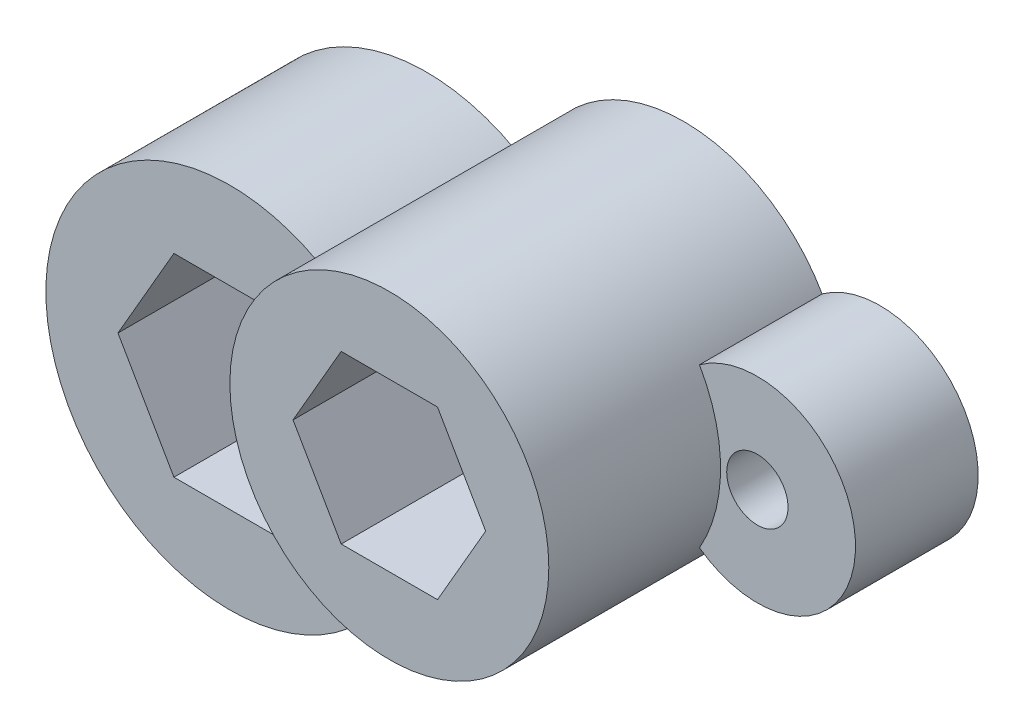
ISO-10303-21;
HEADER;
FILE_DESCRIPTION(('STEP AP214'),'2;1');
FILE_NAME('part.step','',(''),(''),'','','');
FILE_SCHEMA(('AUTOMOTIVE_DESIGN { 1 0 10303 214 1 1 1 1 }'));
ENDSEC;
DATA;
#1=APPLICATION_CONTEXT('core data for automotive mechanical design processes');
#2=APPLICATION_PROTOCOL_DEFINITION('international standard','automotive_design',2000,#1);
#3=PRODUCT_CONTEXT('',#1,'mechanical');
#4=PRODUCT('Part','Part','',(#3));
#5=PRODUCT_RELATED_PRODUCT_CATEGORY('part','',(#4));
#6=PRODUCT_DEFINITION_FORMATION('','',#4);
#7=PRODUCT_DEFINITION_CONTEXT('part definition',#1,'design');
#8=PRODUCT_DEFINITION('design','',#6,#7);
#9=PRODUCT_DEFINITION_SHAPE('','',#8);
#10=(LENGTH_UNIT() NAMED_UNIT(*) SI_UNIT(.MILLI.,.METRE.));
#11=(NAMED_UNIT(*) PLANE_ANGLE_UNIT() SI_UNIT($,.RADIAN.));
#12=(NAMED_UNIT(*) SI_UNIT($,.STERADIAN.) SOLID_ANGLE_UNIT());
#13=UNCERTAINTY_MEASURE_WITH_UNIT(LENGTH_MEASURE(1.E-05),#10,'distance_accuracy_value','');
#14=(GEOMETRIC_REPRESENTATION_CONTEXT(3) GLOBAL_UNCERTAINTY_ASSIGNED_CONTEXT((#13)) GLOBAL_UNIT_ASSIGNED_CONTEXT((#10,
#11,#12)) REPRESENTATION_CONTEXT('',''));
#15=CARTESIAN_POINT('',(0.,0.,0.));
#16=DIRECTION('',(0.,0.,1.));
#17=DIRECTION('',(1.,0.,0.));
#18=AXIS2_PLACEMENT_3D('',#15,#16,#17);
#19=CARTESIAN_POINT('',(0.,0.,8.));
#20=DIRECTION('',(0.,0.,1.));
#21=DIRECTION('',(1.,0.,0.));
#22=AXIS2_PLACEMENT_3D('',#19,#20,#21);
#23=PLANE('',#22);
#24=CARTESIAN_POINT('',(10.5000000000009,4.5,8.));
#25=DIRECTION('',(0.,0.,1.));
#26=DIRECTION('',(1.,0.,0.));
#27=AXIS2_PLACEMENT_3D('',#24,#25,#26);
#28=CIRCLE('',#27,6.50000000000048);
#29=CARTESIAN_POINT('',(4.22530233261804,6.19651677944735,8.));
#30=VERTEX_POINT('',#29);
#31=CARTESIAN_POINT('',(7.40113444899148,-1.21375815875798,8.));
#32=VERTEX_POINT('',#31);
#33=EDGE_CURVE('E165',#30,#32,#28,.T.);
#34=ORIENTED_EDGE('',*,*,#33,.F.);
#35=CARTESIAN_POINT('',(0.,0.,8.));
#36=DIRECTION('',(0.,0.,1.));
#37=DIRECTION('',(1.,0.,0.));
#38=AXIS2_PLACEMENT_3D('',#35,#36,#37);
#39=CIRCLE('',#38,7.5);
#40=EDGE_CURVE('E217',#30,#32,#39,.T.);
#41=ORIENTED_EDGE('',*,*,#40,.T.);
#42=EDGE_LOOP('',(#34,#41));
#43=FACE_BOUND('',#42,.T.);
#44=DIRECTION('',(0.5,0.866025403784439,0.));
#45=VECTOR('',#44,1.);
#46=CARTESIAN_POINT('',(2.28053356329902,-3.95,8.));
#47=LINE('',#46,#45);
#48=CARTESIAN_POINT('',(2.28053356329902,-3.95,8.));
#49=VERTEX_POINT('',#48);
#50=CARTESIAN_POINT('',(4.56106712659804,0.,8.));
#51=VERTEX_POINT('',#50);
#52=EDGE_CURVE('E175',#49,#51,#47,.T.);
#53=ORIENTED_EDGE('',*,*,#52,.F.);
#54=DIRECTION('',(1.,0.,0.));
#55=VECTOR('',#54,1.);
#56=CARTESIAN_POINT('',(-2.28053356329902,-3.95,8.));
#57=LINE('',#56,#55);
#58=CARTESIAN_POINT('',(-2.28053356329902,-3.95,8.));
#59=VERTEX_POINT('',#58);
#60=EDGE_CURVE('E173',#59,#49,#57,.T.);
#61=ORIENTED_EDGE('',*,*,#60,.F.);
#62=DIRECTION('',(0.5,-0.866025403784439,0.));
#63=VECTOR('',#62,1.);
#64=CARTESIAN_POINT('',(-4.56106712659804,0.,8.));
#65=LINE('',#64,#63);
#66=CARTESIAN_POINT('',(-4.56106712659804,0.,8.));
#67=VERTEX_POINT('',#66);
#68=EDGE_CURVE('E185',#67,#59,#65,.T.);
#69=ORIENTED_EDGE('',*,*,#68,.F.);
#70=DIRECTION('',(-0.5,-0.866025403784439,0.));
#71=VECTOR('',#70,1.);
#72=CARTESIAN_POINT('',(-2.28053356329902,3.95,8.));
#73=LINE('',#72,#71);
#74=CARTESIAN_POINT('',(-2.28053356329902,3.95,8.));
#75=VERTEX_POINT('',#74);
#76=EDGE_CURVE('E182',#75,#67,#73,.T.);
#77=ORIENTED_EDGE('',*,*,#76,.F.);
#78=DIRECTION('',(-1.,0.,0.));
#79=VECTOR('',#78,1.);
#80=CARTESIAN_POINT('',(2.28053356329902,3.95,8.));
#81=LINE('',#80,#79);
#82=CARTESIAN_POINT('',(2.28053356329902,3.95,8.));
#83=VERTEX_POINT('',#82);
#84=EDGE_CURVE('E180',#83,#75,#81,.T.);
#85=ORIENTED_EDGE('',*,*,#84,.F.);
#86=DIRECTION('',(-0.5,0.866025403784439,0.));
#87=VECTOR('',#86,1.);
#88=CARTESIAN_POINT('',(4.56106712659804,0.,8.));
#89=LINE('',#88,#87);
#90=EDGE_CURVE('E178',#51,#83,#89,.T.);
#91=ORIENTED_EDGE('',*,*,#90,.F.);
#92=EDGE_LOOP('',(#53,#61,#69,#77,#85,#91));
#93=FACE_BOUND('',#92,.T.);
#94=ADVANCED_FACE('F33',(#43,#93),#23,.T.);
#95=CARTESIAN_POINT('',(0.,0.,0.));
#96=DIRECTION('',(0.,0.,1.));
#97=DIRECTION('',(1.,0.,0.));
#98=AXIS2_PLACEMENT_3D('',#95,#96,#97);
#99=PLANE('',#98);
#100=CARTESIAN_POINT('',(10.5000000000009,4.5,0.));
#101=DIRECTION('',(0.,0.,-1.));
#102=DIRECTION('',(-1.,0.,0.));
#103=AXIS2_PLACEMENT_3D('',#100,#101,#102);
#104=CIRCLE('',#103,6.50000000000048);
#105=CARTESIAN_POINT('',(4.22530233261804,6.19651677944735,0.));
#106=VERTEX_POINT('',#105);
#107=CARTESIAN_POINT('',(16.1406250000013,7.73006959822488,0.));
#108=VERTEX_POINT('',#107);
#109=EDGE_CURVE('E156',#106,#108,#104,.T.);
#110=ORIENTED_EDGE('',*,*,#109,.T.);
#111=CARTESIAN_POINT('',(18.5000000000009,4.49999999999996,0.));
#112=DIRECTION('',(0.,0.,-1.));
#113=DIRECTION('',(-1.,0.,0.));
#114=AXIS2_PLACEMENT_3D('',#111,#112,#113);
#115=CIRCLE('',#114,4.);
#116=CARTESIAN_POINT('',(16.1406250000013,1.26993040177507,0.));
#117=VERTEX_POINT('',#116);
#118=EDGE_CURVE('E48',#108,#117,#115,.T.);
#119=ORIENTED_EDGE('',*,*,#118,.T.);
#120=CARTESIAN_POINT('',(7.40113444899148,-1.21375815875798,0.));
#121=VERTEX_POINT('',#120);
#122=EDGE_CURVE('E52',#117,#121,#104,.T.);
#123=ORIENTED_EDGE('',*,*,#122,.T.);
#124=CARTESIAN_POINT('',(0.,0.,0.));
#125=DIRECTION('',(0.,0.,1.));
#126=DIRECTION('',(1.,0.,0.));
#127=AXIS2_PLACEMENT_3D('',#124,#125,#126);
#128=CIRCLE('',#127,7.5);
#129=EDGE_CURVE('E160',#106,#121,#128,.T.);
#130=ORIENTED_EDGE('',*,*,#129,.F.);
#131=EDGE_LOOP('',(#110,#119,#123,#130));
#132=FACE_BOUND('',#131,.T.);
#133=DIRECTION('',(1.,0.,0.));
#134=VECTOR('',#133,1.);
#135=CARTESIAN_POINT('',(-2.28053356329902,-3.95,0.));
#136=LINE('',#135,#134);
#137=CARTESIAN_POINT('',(-2.28053356329902,-3.95,0.));
#138=VERTEX_POINT('',#137);
#139=CARTESIAN_POINT('',(2.28053356329902,-3.95,0.));
#140=VERTEX_POINT('',#139);
#141=EDGE_CURVE('E172',#138,#140,#136,.T.);
#142=ORIENTED_EDGE('',*,*,#141,.T.);
#143=DIRECTION('',(0.5,0.866025403784439,0.));
#144=VECTOR('',#143,1.);
#145=CARTESIAN_POINT('',(2.28053356329902,-3.95,0.));
#146=LINE('',#145,#144);
#147=CARTESIAN_POINT('',(4.56106712659804,0.,0.));
#148=VERTEX_POINT('',#147);
#149=EDGE_CURVE('E190',#140,#148,#146,.T.);
#150=ORIENTED_EDGE('',*,*,#149,.T.);
#151=DIRECTION('',(-0.5,0.866025403784439,0.));
#152=VECTOR('',#151,1.);
#153=CARTESIAN_POINT('',(4.56106712659804,0.,0.));
#154=LINE('',#153,#152);
#155=CARTESIAN_POINT('',(2.28053356329902,3.95,0.));
#156=VERTEX_POINT('',#155);
#157=EDGE_CURVE('E193',#148,#156,#154,.T.);
#158=ORIENTED_EDGE('',*,*,#157,.T.);
#159=DIRECTION('',(-1.,0.,0.));
#160=VECTOR('',#159,1.);
#161=CARTESIAN_POINT('',(2.28053356329902,3.95,0.));
#162=LINE('',#161,#160);
#163=CARTESIAN_POINT('',(-2.28053356329902,3.95,0.));
#164=VERTEX_POINT('',#163);
#165=EDGE_CURVE('E196',#156,#164,#162,.T.);
#166=ORIENTED_EDGE('',*,*,#165,.T.);
#167=DIRECTION('',(-0.5,-0.866025403784439,0.));
#168=VECTOR('',#167,1.);
#169=CARTESIAN_POINT('',(-2.28053356329902,3.95,0.));
#170=LINE('',#169,#168);
#171=CARTESIAN_POINT('',(-4.56106712659804,0.,0.));
#172=VERTEX_POINT('',#171);
#173=EDGE_CURVE('E199',#164,#172,#170,.T.);
#174=ORIENTED_EDGE('',*,*,#173,.T.);
#175=DIRECTION('',(0.5,-0.866025403784439,0.));
#176=VECTOR('',#175,1.);
#177=CARTESIAN_POINT('',(-4.56106712659804,0.,0.));
#178=LINE('',#177,#176);
#179=EDGE_CURVE('E176',#172,#138,#178,.T.);
#180=ORIENTED_EDGE('',*,*,#179,.T.);
#181=EDGE_LOOP('',(#142,#150,#158,#166,#174,#180));
#182=FACE_BOUND('',#181,.T.);
#183=DIRECTION('',(-1.,0.,0.));
#184=VECTOR('',#183,1.);
#185=CARTESIAN_POINT('',(12.4629909152456,1.1,0.));
#186=LINE('',#185,#184);
#187=CARTESIAN_POINT('',(12.4629909152456,1.1,0.));
#188=VERTEX_POINT('',#187);
#189=CARTESIAN_POINT('',(8.53700908475617,1.1,0.));
#190=VERTEX_POINT('',#189);
#191=EDGE_CURVE('E450',#188,#190,#186,.T.);
#192=ORIENTED_EDGE('',*,*,#191,.F.);
#193=DIRECTION('',(-0.5,-0.866025403784439,0.));
#194=VECTOR('',#193,1.);
#195=CARTESIAN_POINT('',(14.4259818304903,4.5,0.));
#196=LINE('',#195,#194);
#197=CARTESIAN_POINT('',(14.4259818304903,4.5,0.));
#198=VERTEX_POINT('',#197);
#199=EDGE_CURVE('E456',#198,#188,#196,.T.);
#200=ORIENTED_EDGE('',*,*,#199,.F.);
#201=DIRECTION('',(0.500000000000056,-0.866025403784406,0.));
#202=VECTOR('',#201,1.);
#203=CARTESIAN_POINT('',(12.4629909152453,7.89999999999999,0.));
#204=LINE('',#203,#202);
#205=CARTESIAN_POINT('',(12.4629909152453,7.89999999999999,0.));
#206=VERTEX_POINT('',#205);
#207=EDGE_CURVE('E482',#206,#198,#204,.T.);
#208=ORIENTED_EDGE('',*,*,#207,.F.);
#209=DIRECTION('',(1.,0.,0.));
#210=VECTOR('',#209,1.);
#211=CARTESIAN_POINT('',(8.53700908475616,7.89999999999999,0.));
#212=LINE('',#211,#210);
#213=CARTESIAN_POINT('',(8.53700908475616,7.89999999999999,0.));
#214=VERTEX_POINT('',#213);
#215=EDGE_CURVE('E479',#214,#206,#212,.T.);
#216=ORIENTED_EDGE('',*,*,#215,.F.);
#217=DIRECTION('',(0.5,0.866025403784438,0.));
#218=VECTOR('',#217,1.);
#219=CARTESIAN_POINT('',(6.57401816951144,4.5,0.));
#220=LINE('',#219,#218);
#221=CARTESIAN_POINT('',(6.57401816951144,4.5,0.));
#222=VERTEX_POINT('',#221);
#223=EDGE_CURVE('E476',#222,#214,#220,.T.);
#224=ORIENTED_EDGE('',*,*,#223,.F.);
#225=DIRECTION('',(-0.5,0.866025403784439,0.));
#226=VECTOR('',#225,1.);
#227=CARTESIAN_POINT('',(8.53700908475617,1.1,0.));
#228=LINE('',#227,#226);
#229=EDGE_CURVE('E473',#190,#222,#228,.T.);
#230=ORIENTED_EDGE('',*,*,#229,.F.);
#231=EDGE_LOOP('',(#192,#200,#208,#216,#224,#230));
#232=FACE_BOUND('',#231,.T.);
#233=CARTESIAN_POINT('',(18.5000000000009,4.49999999999996,0.));
#234=DIRECTION('',(0.,0.,-1.));
#235=DIRECTION('',(-1.,0.,0.));
#236=AXIS2_PLACEMENT_3D('',#233,#234,#235);
#237=CIRCLE('',#236,1.25000000000104);
#238=CARTESIAN_POINT('',(17.2499999999999,4.49999999999996,0.));
#239=VERTEX_POINT('',#238);
#240=EDGE_CURVE('E445',#239,#239,#237,.T.);
#241=ORIENTED_EDGE('',*,*,#240,.F.);
#242=EDGE_LOOP('',(#241));
#243=FACE_BOUND('',#242,.T.);
#244=ADVANCED_FACE('F158',(#132,#182,#232,#243),#99,.F.);
#245=CARTESIAN_POINT('',(0.,0.,8.));
#246=DIRECTION('',(0.,0.,-1.));
#247=DIRECTION('',(-1.,0.,0.));
#248=AXIS2_PLACEMENT_3D('',#245,#246,#247);
#249=CYLINDRICAL_SURFACE('',#248,7.5);
#250=ORIENTED_EDGE('',*,*,#129,.T.);
#251=DIRECTION('',(0.,0.,-1.));
#252=VECTOR('',#251,1.);
#253=CARTESIAN_POINT('',(7.40113444899148,-1.21375815875798,6.));
#254=LINE('',#253,#252);
#255=EDGE_CURVE('E223',#121,#32,#254,.F.);
#256=ORIENTED_EDGE('',*,*,#255,.T.);
#257=ORIENTED_EDGE('',*,*,#40,.F.);
#258=DIRECTION('',(0.,0.,-1.));
#259=VECTOR('',#258,1.);
#260=CARTESIAN_POINT('',(4.22530233261804,6.19651677944735,6.));
#261=LINE('',#260,#259);
#262=EDGE_CURVE('E220',#30,#106,#261,.T.);
#263=ORIENTED_EDGE('',*,*,#262,.T.);
#264=EDGE_LOOP('',(#250,#256,#257,#263));
#265=FACE_BOUND('',#264,.T.);
#266=ADVANCED_FACE('F35',(#265),#249,.T.);
#267=CARTESIAN_POINT('',(-2.28053356329902,-3.95,8.));
#268=DIRECTION('',(0.,1.,0.));
#269=DIRECTION('',(-1.,0.,0.));
#270=AXIS2_PLACEMENT_3D('',#267,#268,#269);
#271=PLANE('',#270);
#272=ORIENTED_EDGE('',*,*,#141,.F.);
#273=DIRECTION('',(0.,0.,-1.));
#274=VECTOR('',#273,1.);
#275=CARTESIAN_POINT('',(-2.28053356329902,-3.95,8.));
#276=LINE('',#275,#274);
#277=EDGE_CURVE('E187',#59,#138,#276,.T.);
#278=ORIENTED_EDGE('',*,*,#277,.F.);
#279=ORIENTED_EDGE('',*,*,#60,.T.);
#280=DIRECTION('',(0.,0.,-1.));
#281=VECTOR('',#280,1.);
#282=CARTESIAN_POINT('',(2.28053356329902,-3.95,8.));
#283=LINE('',#282,#281);
#284=EDGE_CURVE('E214',#49,#140,#283,.T.);
#285=ORIENTED_EDGE('',*,*,#284,.T.);
#286=EDGE_LOOP('',(#272,#278,#279,#285));
#287=FACE_BOUND('',#286,.T.);
#288=ADVANCED_FACE('F248',(#287),#271,.T.);
#289=CARTESIAN_POINT('',(2.28053356329902,-3.95,8.));
#290=DIRECTION('',(-0.866025403784439,0.5,0.));
#291=DIRECTION('',(-0.5,-0.866025403784439,0.));
#292=AXIS2_PLACEMENT_3D('',#289,#290,#291);
#293=PLANE('',#292);
#294=ORIENTED_EDGE('',*,*,#149,.F.);
#295=ORIENTED_EDGE('',*,*,#284,.F.);
#296=ORIENTED_EDGE('',*,*,#52,.T.);
#297=DIRECTION('',(0.,0.,-1.));
#298=VECTOR('',#297,1.);
#299=CARTESIAN_POINT('',(4.56106712659804,0.,8.));
#300=LINE('',#299,#298);
#301=EDGE_CURVE('E212',#51,#148,#300,.T.);
#302=ORIENTED_EDGE('',*,*,#301,.T.);
#303=EDGE_LOOP('',(#294,#295,#296,#302));
#304=FACE_BOUND('',#303,.T.);
#305=ADVANCED_FACE('F240',(#304),#293,.T.);
#306=CARTESIAN_POINT('',(4.56106712659804,0.,8.));
#307=DIRECTION('',(-0.866025403784439,-0.5,0.));
#308=DIRECTION('',(0.5,-0.866025403784439,0.));
#309=AXIS2_PLACEMENT_3D('',#306,#307,#308);
#310=PLANE('',#309);
#311=ORIENTED_EDGE('',*,*,#157,.F.);
#312=ORIENTED_EDGE('',*,*,#301,.F.);
#313=ORIENTED_EDGE('',*,*,#90,.T.);
#314=DIRECTION('',(0.,0.,-1.));
#315=VECTOR('',#314,1.);
#316=CARTESIAN_POINT('',(2.28053356329902,3.95,8.));
#317=LINE('',#316,#315);
#318=EDGE_CURVE('E210',#83,#156,#317,.T.);
#319=ORIENTED_EDGE('',*,*,#318,.T.);
#320=EDGE_LOOP('',(#311,#312,#313,#319));
#321=FACE_BOUND('',#320,.T.);
#322=ADVANCED_FACE('F243',(#321),#310,.T.);
#323=CARTESIAN_POINT('',(2.28053356329902,3.95,8.));
#324=DIRECTION('',(0.,-1.,0.));
#325=DIRECTION('',(1.,0.,0.));
#326=AXIS2_PLACEMENT_3D('',#323,#324,#325);
#327=PLANE('',#326);
#328=ORIENTED_EDGE('',*,*,#165,.F.);
#329=ORIENTED_EDGE('',*,*,#318,.F.);
#330=ORIENTED_EDGE('',*,*,#84,.T.);
#331=DIRECTION('',(0.,0.,-1.));
#332=VECTOR('',#331,1.);
#333=CARTESIAN_POINT('',(-2.28053356329902,3.95,8.));
#334=LINE('',#333,#332);
#335=EDGE_CURVE('E208',#75,#164,#334,.T.);
#336=ORIENTED_EDGE('',*,*,#335,.T.);
#337=EDGE_LOOP('',(#328,#329,#330,#336));
#338=FACE_BOUND('',#337,.T.);
#339=ADVANCED_FACE('F259',(#338),#327,.T.);
#340=CARTESIAN_POINT('',(-2.28053356329902,3.95,8.));
#341=DIRECTION('',(0.866025403784439,-0.5,0.));
#342=DIRECTION('',(0.5,0.866025403784439,0.));
#343=AXIS2_PLACEMENT_3D('',#340,#341,#342);
#344=PLANE('',#343);
#345=ORIENTED_EDGE('',*,*,#173,.F.);
#346=ORIENTED_EDGE('',*,*,#335,.F.);
#347=ORIENTED_EDGE('',*,*,#76,.T.);
#348=DIRECTION('',(0.,0.,-1.));
#349=VECTOR('',#348,1.);
#350=CARTESIAN_POINT('',(-4.56106712659804,0.,8.));
#351=LINE('',#350,#349);
#352=EDGE_CURVE('E206',#67,#172,#351,.T.);
#353=ORIENTED_EDGE('',*,*,#352,.T.);
#354=EDGE_LOOP('',(#345,#346,#347,#353));
#355=FACE_BOUND('',#354,.T.);
#356=ADVANCED_FACE('F256',(#355),#344,.T.);
#357=CARTESIAN_POINT('',(-4.56106712659804,0.,8.));
#358=DIRECTION('',(0.866025403784439,0.5,0.));
#359=DIRECTION('',(-0.5,0.866025403784439,0.));
#360=AXIS2_PLACEMENT_3D('',#357,#358,#359);
#361=PLANE('',#360);
#362=ORIENTED_EDGE('',*,*,#179,.F.);
#363=ORIENTED_EDGE('',*,*,#352,.F.);
#364=ORIENTED_EDGE('',*,*,#68,.T.);
#365=ORIENTED_EDGE('',*,*,#277,.T.);
#366=EDGE_LOOP('',(#362,#363,#364,#365));
#367=FACE_BOUND('',#366,.T.);
#368=ADVANCED_FACE('F252',(#367),#361,.T.);
#369=CARTESIAN_POINT('',(10.5000000000009,4.5,12.));
#370=DIRECTION('',(0.,0.,-1.));
#371=DIRECTION('',(-1.,0.,0.));
#372=AXIS2_PLACEMENT_3D('',#369,#370,#371);
#373=CYLINDRICAL_SURFACE('',#372,6.50000000000048);
#374=DIRECTION('',(0.,0.,-1.));
#375=VECTOR('',#374,1.);
#376=CARTESIAN_POINT('',(16.1406250000013,1.26993040177507,2.5));
#377=LINE('',#376,#375);
#378=CARTESIAN_POINT('',(16.1406250000013,1.26993040177506,5.));
#379=VERTEX_POINT('',#378);
#380=EDGE_CURVE('E11',#379,#117,#377,.T.);
#381=ORIENTED_EDGE('',*,*,#380,.F.);
#382=CARTESIAN_POINT('',(10.5000000000009,4.5,5.));
#383=DIRECTION('',(0.,0.,-1.));
#384=DIRECTION('',(-1.,0.,0.));
#385=AXIS2_PLACEMENT_3D('',#382,#383,#384);
#386=CIRCLE('',#385,6.50000000000048);
#387=CARTESIAN_POINT('',(16.1406250000013,7.73006959822488,5.));
#388=VERTEX_POINT('',#387);
#389=EDGE_CURVE('E157',#379,#388,#386,.F.);
#390=ORIENTED_EDGE('',*,*,#389,.T.);
#391=DIRECTION('',(0.,0.,-1.));
#392=VECTOR('',#391,1.);
#393=CARTESIAN_POINT('',(16.1406250000013,7.73006959822488,2.5));
#394=LINE('',#393,#392);
#395=EDGE_CURVE('E41',#108,#388,#394,.F.);
#396=ORIENTED_EDGE('',*,*,#395,.F.);
#397=ORIENTED_EDGE('',*,*,#109,.F.);
#398=ORIENTED_EDGE('',*,*,#262,.F.);
#399=ORIENTED_EDGE('',*,*,#33,.T.);
#400=ORIENTED_EDGE('',*,*,#255,.F.);
#401=ORIENTED_EDGE('',*,*,#122,.F.);
#402=EDGE_LOOP('',(#381,#390,#396,#397,#398,#399,#400,#401));
#403=FACE_BOUND('',#402,.T.);
#404=CARTESIAN_POINT('',(10.5000000000009,4.5,12.));
#405=DIRECTION('',(0.,0.,-1.));
#406=DIRECTION('',(-1.,0.,0.));
#407=AXIS2_PLACEMENT_3D('',#404,#405,#406);
#408=CIRCLE('',#407,6.50000000000048);
#409=CARTESIAN_POINT('',(4.00000000000041,4.5,12.));
#410=VERTEX_POINT('',#409);
#411=EDGE_CURVE('E162',#410,#410,#408,.T.);
#412=ORIENTED_EDGE('',*,*,#411,.T.);
#413=EDGE_LOOP('',(#412));
#414=FACE_BOUND('',#413,.T.);
#415=ADVANCED_FACE('F153',(#403,#414),#373,.T.);
#416=CARTESIAN_POINT('',(10.5000000000009,4.5,12.));
#417=DIRECTION('',(0.,0.,-1.));
#418=DIRECTION('',(-1.,0.,0.));
#419=AXIS2_PLACEMENT_3D('',#416,#417,#418);
#420=PLANE('',#419);
#421=DIRECTION('',(-0.5,-0.866025403784439,0.));
#422=VECTOR('',#421,1.);
#423=CARTESIAN_POINT('',(14.4259818304903,4.5,12.));
#424=LINE('',#423,#422);
#425=CARTESIAN_POINT('',(14.4259818304903,4.5,12.));
#426=VERTEX_POINT('',#425);
#427=CARTESIAN_POINT('',(12.4629909152456,1.1,12.));
#428=VERTEX_POINT('',#427);
#429=EDGE_CURVE('E468',#426,#428,#424,.T.);
#430=ORIENTED_EDGE('',*,*,#429,.T.);
#431=DIRECTION('',(-1.,0.,0.));
#432=VECTOR('',#431,1.);
#433=CARTESIAN_POINT('',(12.4629909152456,1.1,12.));
#434=LINE('',#433,#432);
#435=CARTESIAN_POINT('',(8.53700908475617,1.1,12.));
#436=VERTEX_POINT('',#435);
#437=EDGE_CURVE('E452',#428,#436,#434,.T.);
#438=ORIENTED_EDGE('',*,*,#437,.T.);
#439=DIRECTION('',(-0.5,0.866025403784439,0.));
#440=VECTOR('',#439,1.);
#441=CARTESIAN_POINT('',(8.53700908475617,1.1,12.));
#442=LINE('',#441,#440);
#443=CARTESIAN_POINT('',(6.57401816951144,4.5,12.));
#444=VERTEX_POINT('',#443);
#445=EDGE_CURVE('E455',#436,#444,#442,.T.);
#446=ORIENTED_EDGE('',*,*,#445,.T.);
#447=DIRECTION('',(0.5,0.866025403784438,0.));
#448=VECTOR('',#447,1.);
#449=CARTESIAN_POINT('',(6.57401816951144,4.5,12.));
#450=LINE('',#449,#448);
#451=CARTESIAN_POINT('',(8.53700908475616,7.89999999999999,12.));
#452=VERTEX_POINT('',#451);
#453=EDGE_CURVE('E459',#444,#452,#450,.T.);
#454=ORIENTED_EDGE('',*,*,#453,.T.);
#455=DIRECTION('',(1.,0.,0.));
#456=VECTOR('',#455,1.);
#457=CARTESIAN_POINT('',(8.53700908475616,7.89999999999999,12.));
#458=LINE('',#457,#456);
#459=CARTESIAN_POINT('',(12.4629909152453,7.89999999999999,12.));
#460=VERTEX_POINT('',#459);
#461=EDGE_CURVE('E462',#452,#460,#458,.T.);
#462=ORIENTED_EDGE('',*,*,#461,.T.);
#463=DIRECTION('',(0.500000000000056,-0.866025403784406,0.));
#464=VECTOR('',#463,1.);
#465=CARTESIAN_POINT('',(12.4629909152453,7.89999999999999,12.));
#466=LINE('',#465,#464);
#467=EDGE_CURVE('E465',#460,#426,#466,.T.);
#468=ORIENTED_EDGE('',*,*,#467,.T.);
#469=EDGE_LOOP('',(#430,#438,#446,#454,#462,#468));
#470=FACE_BOUND('',#469,.T.);
#471=ORIENTED_EDGE('',*,*,#411,.F.);
#472=EDGE_LOOP('',(#471));
#473=FACE_BOUND('',#472,.T.);
#474=ADVANCED_FACE('F287',(#470,#473),#420,.F.);
#475=CARTESIAN_POINT('',(12.4629909152456,1.1,12.));
#476=DIRECTION('',(0.,-1.,0.));
#477=DIRECTION('',(1.,0.,0.));
#478=AXIS2_PLACEMENT_3D('',#475,#476,#477);
#479=PLANE('',#478);
#480=ORIENTED_EDGE('',*,*,#191,.T.);
#481=DIRECTION('',(0.,0.,-1.));
#482=VECTOR('',#481,1.);
#483=CARTESIAN_POINT('',(8.53700908475617,1.1,12.));
#484=LINE('',#483,#482);
#485=EDGE_CURVE('E471',#436,#190,#484,.T.);
#486=ORIENTED_EDGE('',*,*,#485,.F.);
#487=ORIENTED_EDGE('',*,*,#437,.F.);
#488=DIRECTION('',(0.,0.,-1.));
#489=VECTOR('',#488,1.);
#490=CARTESIAN_POINT('',(12.4629909152456,1.1,12.));
#491=LINE('',#490,#489);
#492=EDGE_CURVE('E167',#428,#188,#491,.T.);
#493=ORIENTED_EDGE('',*,*,#492,.T.);
#494=EDGE_LOOP('',(#480,#486,#487,#493));
#495=FACE_BOUND('',#494,.T.);
#496=ADVANCED_FACE('F292',(#495),#479,.F.);
#497=CARTESIAN_POINT('',(14.4259818304903,4.5,12.));
#498=DIRECTION('',(0.866025403784439,-0.5,0.));
#499=DIRECTION('',(0.5,0.866025403784439,0.));
#500=AXIS2_PLACEMENT_3D('',#497,#498,#499);
#501=PLANE('',#500);
#502=ORIENTED_EDGE('',*,*,#199,.T.);
#503=ORIENTED_EDGE('',*,*,#492,.F.);
#504=ORIENTED_EDGE('',*,*,#429,.F.);
#505=DIRECTION('',(0.,0.,-1.));
#506=VECTOR('',#505,1.);
#507=CARTESIAN_POINT('',(14.4259818304903,4.5,12.));
#508=LINE('',#507,#506);
#509=EDGE_CURVE('E488',#426,#198,#508,.T.);
#510=ORIENTED_EDGE('',*,*,#509,.T.);
#511=EDGE_LOOP('',(#502,#503,#504,#510));
#512=FACE_BOUND('',#511,.T.);
#513=ADVANCED_FACE('F303',(#512),#501,.F.);
#514=CARTESIAN_POINT('',(12.4629909152453,7.89999999999999,12.));
#515=DIRECTION('',(0.866025403784406,0.500000000000056,0.));
#516=DIRECTION('',(-0.500000000000056,0.866025403784406,0.));
#517=AXIS2_PLACEMENT_3D('',#514,#515,#516);
#518=PLANE('',#517);
#519=ORIENTED_EDGE('',*,*,#207,.T.);
#520=ORIENTED_EDGE('',*,*,#509,.F.);
#521=ORIENTED_EDGE('',*,*,#467,.F.);
#522=DIRECTION('',(0.,0.,-1.));
#523=VECTOR('',#522,1.);
#524=CARTESIAN_POINT('',(12.4629909152453,7.89999999999999,12.));
#525=LINE('',#524,#523);
#526=EDGE_CURVE('E490',#460,#206,#525,.T.);
#527=ORIENTED_EDGE('',*,*,#526,.T.);
#528=EDGE_LOOP('',(#519,#520,#521,#527));
#529=FACE_BOUND('',#528,.T.);
#530=ADVANCED_FACE('F313',(#529),#518,.F.);
#531=CARTESIAN_POINT('',(8.53700908475616,7.89999999999999,12.));
#532=DIRECTION('',(0.,1.,0.));
#533=DIRECTION('',(0.,0.,1.));
#534=AXIS2_PLACEMENT_3D('',#531,#532,#533);
#535=PLANE('',#534);
#536=ORIENTED_EDGE('',*,*,#215,.T.);
#537=ORIENTED_EDGE('',*,*,#526,.F.);
#538=ORIENTED_EDGE('',*,*,#461,.F.);
#539=DIRECTION('',(0.,0.,-1.));
#540=VECTOR('',#539,1.);
#541=CARTESIAN_POINT('',(8.53700908475616,7.89999999999999,12.));
#542=LINE('',#541,#540);
#543=EDGE_CURVE('E492',#452,#214,#542,.T.);
#544=ORIENTED_EDGE('',*,*,#543,.T.);
#545=EDGE_LOOP('',(#536,#537,#538,#544));
#546=FACE_BOUND('',#545,.T.);
#547=ADVANCED_FACE('F323',(#546),#535,.F.);
#548=CARTESIAN_POINT('',(6.57401816951144,4.5,12.));
#549=DIRECTION('',(-0.866025403784439,0.5,0.));
#550=DIRECTION('',(-0.5,-0.866025403784439,0.));
#551=AXIS2_PLACEMENT_3D('',#548,#549,#550);
#552=PLANE('',#551);
#553=ORIENTED_EDGE('',*,*,#223,.T.);
#554=ORIENTED_EDGE('',*,*,#543,.F.);
#555=ORIENTED_EDGE('',*,*,#453,.F.);
#556=DIRECTION('',(0.,0.,-1.));
#557=VECTOR('',#556,1.);
#558=CARTESIAN_POINT('',(6.57401816951144,4.5,12.));
#559=LINE('',#558,#557);
#560=EDGE_CURVE('E494',#444,#222,#559,.T.);
#561=ORIENTED_EDGE('',*,*,#560,.T.);
#562=EDGE_LOOP('',(#553,#554,#555,#561));
#563=FACE_BOUND('',#562,.T.);
#564=ADVANCED_FACE('F333',(#563),#552,.F.);
#565=CARTESIAN_POINT('',(8.53700908475617,1.1,12.));
#566=DIRECTION('',(-0.866025403784439,-0.5,0.));
#567=DIRECTION('',(0.5,-0.866025403784439,0.));
#568=AXIS2_PLACEMENT_3D('',#565,#566,#567);
#569=PLANE('',#568);
#570=ORIENTED_EDGE('',*,*,#229,.T.);
#571=ORIENTED_EDGE('',*,*,#560,.F.);
#572=ORIENTED_EDGE('',*,*,#445,.F.);
#573=ORIENTED_EDGE('',*,*,#485,.T.);
#574=EDGE_LOOP('',(#570,#571,#572,#573));
#575=FACE_BOUND('',#574,.T.);
#576=ADVANCED_FACE('F343',(#575),#569,.F.);
#577=CARTESIAN_POINT('',(18.5000000000009,4.49999999999996,5.));
#578=DIRECTION('',(0.,0.,-1.));
#579=DIRECTION('',(-1.,0.,0.));
#580=AXIS2_PLACEMENT_3D('',#577,#578,#579);
#581=CYLINDRICAL_SURFACE('',#580,4.);
#582=CARTESIAN_POINT('',(18.5000000000009,4.49999999999996,5.));
#583=DIRECTION('',(0.,0.,-1.));
#584=DIRECTION('',(-1.,0.,0.));
#585=AXIS2_PLACEMENT_3D('',#582,#583,#584);
#586=CIRCLE('',#585,4.);
#587=EDGE_CURVE('E147',#388,#379,#586,.T.);
#588=ORIENTED_EDGE('',*,*,#587,.T.);
#589=ORIENTED_EDGE('',*,*,#380,.T.);
#590=ORIENTED_EDGE('',*,*,#118,.F.);
#591=ORIENTED_EDGE('',*,*,#395,.T.);
#592=EDGE_LOOP('',(#588,#589,#590,#591));
#593=FACE_BOUND('',#592,.T.);
#594=ADVANCED_FACE('F144',(#593),#581,.T.);
#595=CARTESIAN_POINT('',(18.5000000000009,4.49999999999996,5.));
#596=DIRECTION('',(0.,0.,-1.));
#597=DIRECTION('',(-1.,0.,0.));
#598=AXIS2_PLACEMENT_3D('',#595,#596,#597);
#599=PLANE('',#598);
#600=ORIENTED_EDGE('',*,*,#389,.F.);
#601=ORIENTED_EDGE('',*,*,#587,.F.);
#602=EDGE_LOOP('',(#600,#601));
#603=FACE_BOUND('',#602,.T.);
#604=CARTESIAN_POINT('',(18.5000000000009,4.49999999999996,5.));
#605=DIRECTION('',(0.,0.,-1.));
#606=DIRECTION('',(-1.,0.,0.));
#607=AXIS2_PLACEMENT_3D('',#604,#605,#606);
#608=CIRCLE('',#607,1.25000000000104);
#609=CARTESIAN_POINT('',(17.2499999999999,4.49999999999996,5.));
#610=VERTEX_POINT('',#609);
#611=EDGE_CURVE('E148',#610,#610,#608,.T.);
#612=ORIENTED_EDGE('',*,*,#611,.T.);
#613=EDGE_LOOP('',(#612));
#614=FACE_BOUND('',#613,.T.);
#615=ADVANCED_FACE('F373',(#603,#614),#599,.F.);
#616=CARTESIAN_POINT('',(18.5000000000009,4.49999999999996,5.));
#617=DIRECTION('',(0.,0.,-1.));
#618=DIRECTION('',(-1.,0.,0.));
#619=AXIS2_PLACEMENT_3D('',#616,#617,#618);
#620=CYLINDRICAL_SURFACE('',#619,1.25000000000104);
#621=ORIENTED_EDGE('',*,*,#611,.F.);
#622=EDGE_LOOP('',(#621));
#623=FACE_BOUND('',#622,.T.);
#624=ORIENTED_EDGE('',*,*,#240,.T.);
#625=EDGE_LOOP('',(#624));
#626=FACE_BOUND('',#625,.T.);
#627=ADVANCED_FACE('F382',(#623,#626),#620,.F.);
#628=CLOSED_SHELL('',(#94,#244,#266,#288,#305,#322,#339,#356,#368,#415,#474,#496,#513,#530,#547,
#564,#576,#594,#615,#627));
#629=MANIFOLD_SOLID_BREP('B2',#628);
#630=ADVANCED_BREP_SHAPE_REPRESENTATION('',(#18,#629),#14);
#631=SHAPE_DEFINITION_REPRESENTATION(#9,#630);
ENDSEC;
END-ISO-10303-21;
